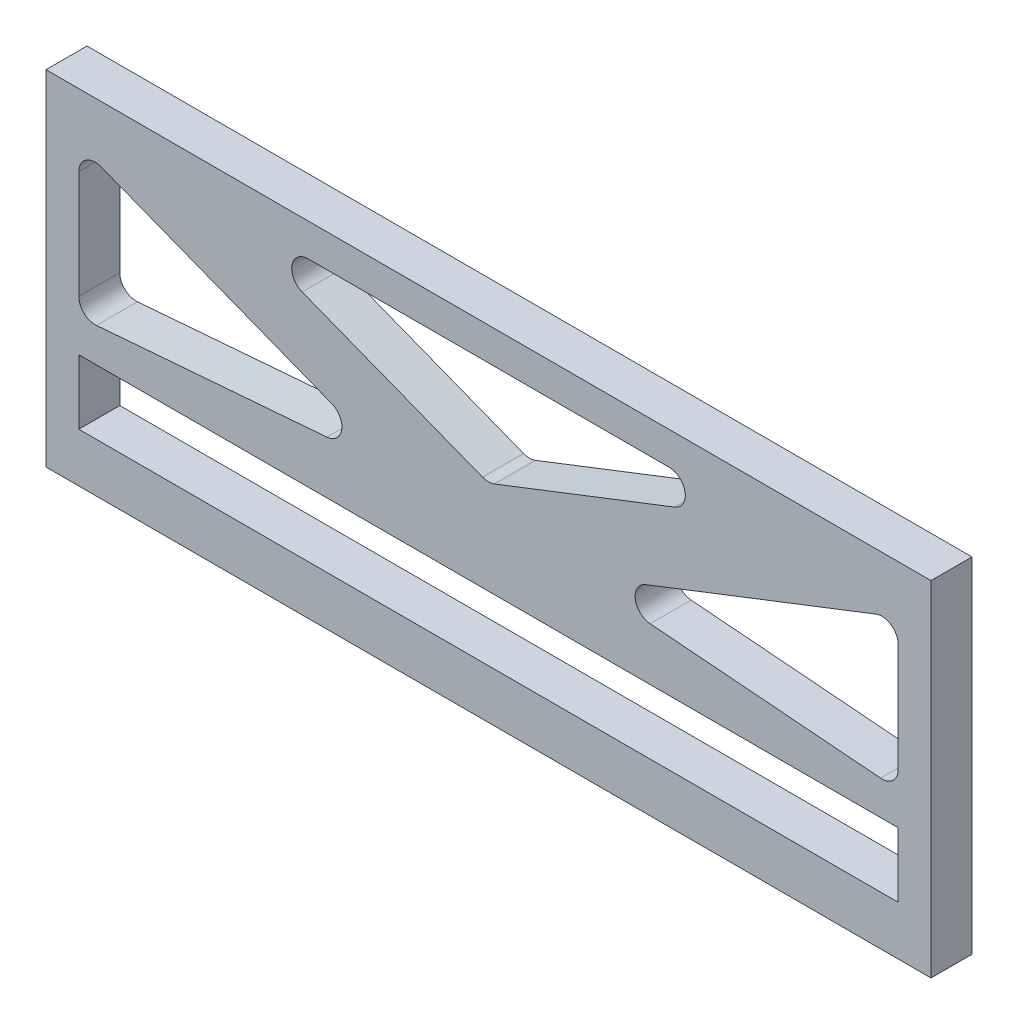
ISO-10303-21;
HEADER;
FILE_DESCRIPTION(('STEP AP214'),'2;1');
FILE_NAME('part.step','',(''),(''),'','','');
FILE_SCHEMA(('AUTOMOTIVE_DESIGN { 1 0 10303 214 1 1 1 1 }'));
ENDSEC;
DATA;
#1=APPLICATION_CONTEXT('core data for automotive mechanical design processes');
#2=APPLICATION_PROTOCOL_DEFINITION('international standard','automotive_design',2000,#1);
#3=PRODUCT_CONTEXT('',#1,'mechanical');
#4=PRODUCT('Part','Part','',(#3));
#5=PRODUCT_RELATED_PRODUCT_CATEGORY('part','',(#4));
#6=PRODUCT_DEFINITION_FORMATION('','',#4);
#7=PRODUCT_DEFINITION_CONTEXT('part definition',#1,'design');
#8=PRODUCT_DEFINITION('design','',#6,#7);
#9=PRODUCT_DEFINITION_SHAPE('','',#8);
#10=(LENGTH_UNIT() NAMED_UNIT(*) SI_UNIT(.MILLI.,.METRE.));
#11=(NAMED_UNIT(*) PLANE_ANGLE_UNIT() SI_UNIT($,.RADIAN.));
#12=(NAMED_UNIT(*) SI_UNIT($,.STERADIAN.) SOLID_ANGLE_UNIT());
#13=UNCERTAINTY_MEASURE_WITH_UNIT(LENGTH_MEASURE(1.E-05),#10,'distance_accuracy_value','');
#14=(GEOMETRIC_REPRESENTATION_CONTEXT(3) GLOBAL_UNCERTAINTY_ASSIGNED_CONTEXT((#13)) GLOBAL_UNIT_ASSIGNED_CONTEXT((#10,
#11,#12)) REPRESENTATION_CONTEXT('',''));
#15=CARTESIAN_POINT('',(0.,0.,0.));
#16=DIRECTION('',(0.,0.,1.));
#17=DIRECTION('',(1.,0.,0.));
#18=AXIS2_PLACEMENT_3D('',#15,#16,#17);
#19=CARTESIAN_POINT('',(0.,0.,3.175));
#20=DIRECTION('',(0.,0.,-1.));
#21=DIRECTION('',(-1.,0.,0.));
#22=AXIS2_PLACEMENT_3D('',#19,#20,#21);
#23=PLANE('',#22);
#24=DIRECTION('',(-0.932004671541296,0.362446261154948,0.));
#25=VECTOR('',#24,1.);
#26=CARTESIAN_POINT('',(-7.0079354437433,0.,3.175));
#27=LINE('',#26,#25);
#28=CARTESIAN_POINT('',(-12.1682666102211,2.00679545363027,3.175));
#29=VERTEX_POINT('',#28);
#30=CARTESIAN_POINT('',(-30.0196932483332,8.94901692400719,3.175));
#31=VERTEX_POINT('',#30);
#32=EDGE_CURVE('E437',#29,#31,#27,.T.);
#33=ORIENTED_EDGE('',*,*,#32,.F.);
#34=CARTESIAN_POINT('',(-12.6285733618879,0.823149520772821,3.175));
#35=DIRECTION('',(0.,0.,-1.));
#36=DIRECTION('',(-1.,0.,0.));
#37=AXIS2_PLACEMENT_3D('',#34,#35,#36);
#38=CIRCLE('',#37,1.27);
#39=CARTESIAN_POINT('',(-12.5270104581819,-0.442782932634869,3.175));
#40=VERTEX_POINT('',#39);
#41=EDGE_CURVE('E412',#29,#40,#38,.T.);
#42=ORIENTED_EDGE('',*,*,#41,.T.);
#43=DIRECTION('',(0.996797207407629,0.07997079031967,0.));
#44=VECTOR('',#43,1.);
#45=CARTESIAN_POINT('',(-31.75,-1.985,3.175));
#46=LINE('',#45,#44);
#47=CARTESIAN_POINT('',(-30.378437096294,-1.87496260365961,3.175));
#48=VERTEX_POINT('',#47);
#49=EDGE_CURVE('E443',#48,#40,#46,.T.);
#50=ORIENTED_EDGE('',*,*,#49,.F.);
#51=CARTESIAN_POINT('',(-30.48,-0.609030150251917,3.175));
#52=DIRECTION('',(0.,0.,-1.));
#53=DIRECTION('',(-1.,0.,0.));
#54=AXIS2_PLACEMENT_3D('',#51,#52,#53);
#55=CIRCLE('',#54,1.27);
#56=CARTESIAN_POINT('',(-31.75,-0.609030150251917,3.175));
#57=VERTEX_POINT('',#56);
#58=EDGE_CURVE('E11',#48,#57,#55,.T.);
#59=ORIENTED_EDGE('',*,*,#58,.T.);
#60=DIRECTION('',(0.,-1.,0.));
#61=VECTOR('',#60,1.);
#62=CARTESIAN_POINT('',(-31.75,9.62191399409983,3.175));
#63=LINE('',#62,#61);
#64=CARTESIAN_POINT('',(-31.75,7.76537099114975,3.175));
#65=VERTEX_POINT('',#64);
#66=EDGE_CURVE('E440',#65,#57,#63,.T.);
#67=ORIENTED_EDGE('',*,*,#66,.F.);
#68=CARTESIAN_POINT('',(-30.48,7.76537099114975,3.175));
#69=DIRECTION('',(0.,0.,-1.));
#70=DIRECTION('',(-1.,0.,0.));
#71=AXIS2_PLACEMENT_3D('',#68,#69,#70);
#72=CIRCLE('',#71,1.27);
#73=EDGE_CURVE('E418',#65,#31,#72,.T.);
#74=ORIENTED_EDGE('',*,*,#73,.T.);
#75=EDGE_LOOP('',(#33,#42,#50,#59,#67,#74));
#76=FACE_BOUND('',#75,.T.);
#77=DIRECTION('',(0.,1.,0.));
#78=VECTOR('',#77,1.);
#79=CARTESIAN_POINT('',(31.75,-9.525,3.175));
#80=LINE('',#79,#78);
#81=CARTESIAN_POINT('',(31.75,-9.525,3.175));
#82=VERTEX_POINT('',#81);
#83=CARTESIAN_POINT('',(31.75,-4.525,3.175));
#84=VERTEX_POINT('',#83);
#85=EDGE_CURVE('E214',#82,#84,#80,.T.);
#86=ORIENTED_EDGE('',*,*,#85,.F.);
#87=DIRECTION('',(1.,0.,0.));
#88=VECTOR('',#87,1.);
#89=CARTESIAN_POINT('',(-31.75,-9.525,3.175));
#90=LINE('',#89,#88);
#91=CARTESIAN_POINT('',(-31.75,-9.525,3.175));
#92=VERTEX_POINT('',#91);
#93=EDGE_CURVE('E244',#92,#82,#90,.T.);
#94=ORIENTED_EDGE('',*,*,#93,.F.);
#95=DIRECTION('',(0.,-1.,0.));
#96=VECTOR('',#95,1.);
#97=CARTESIAN_POINT('',(-31.75,-9.525,3.175));
#98=LINE('',#97,#96);
#99=CARTESIAN_POINT('',(-31.75,-4.525,3.175));
#100=VERTEX_POINT('',#99);
#101=EDGE_CURVE('E240',#100,#92,#98,.T.);
#102=ORIENTED_EDGE('',*,*,#101,.F.);
#103=DIRECTION('',(-1.,0.,0.));
#104=VECTOR('',#103,1.);
#105=CARTESIAN_POINT('',(-31.75,-4.525,3.175));
#106=LINE('',#105,#104);
#107=EDGE_CURVE('E225',#84,#100,#106,.T.);
#108=ORIENTED_EDGE('',*,*,#107,.F.);
#109=EDGE_LOOP('',(#86,#94,#102,#108));
#110=FACE_BOUND('',#109,.T.);
#111=DIRECTION('',(0.,1.,0.));
#112=VECTOR('',#111,1.);
#113=CARTESIAN_POINT('',(34.29,-13.335,3.175));
#114=LINE('',#113,#112);
#115=CARTESIAN_POINT('',(34.29,-13.335,3.175));
#116=VERTEX_POINT('',#115);
#117=CARTESIAN_POINT('',(34.29,13.335,3.175));
#118=VERTEX_POINT('',#117);
#119=EDGE_CURVE('E270',#116,#118,#114,.T.);
#120=ORIENTED_EDGE('',*,*,#119,.T.);
#121=DIRECTION('',(-1.,0.,0.));
#122=VECTOR('',#121,1.);
#123=CARTESIAN_POINT('',(-34.29,13.335,3.175));
#124=LINE('',#123,#122);
#125=CARTESIAN_POINT('',(-34.29,13.335,3.175));
#126=VERTEX_POINT('',#125);
#127=EDGE_CURVE('E274',#118,#126,#124,.T.);
#128=ORIENTED_EDGE('',*,*,#127,.T.);
#129=DIRECTION('',(0.,-1.,0.));
#130=VECTOR('',#129,1.);
#131=CARTESIAN_POINT('',(-34.29,-13.335,3.175));
#132=LINE('',#131,#130);
#133=CARTESIAN_POINT('',(-34.29,-13.335,3.175));
#134=VERTEX_POINT('',#133);
#135=EDGE_CURVE('E278',#126,#134,#132,.T.);
#136=ORIENTED_EDGE('',*,*,#135,.T.);
#137=DIRECTION('',(1.,0.,0.));
#138=VECTOR('',#137,1.);
#139=CARTESIAN_POINT('',(-34.29,-13.335,3.175));
#140=LINE('',#139,#138);
#141=EDGE_CURVE('E281',#134,#116,#140,.T.);
#142=ORIENTED_EDGE('',*,*,#141,.T.);
#143=EDGE_LOOP('',(#120,#128,#136,#142));
#144=FACE_BOUND('',#143,.T.);
#145=DIRECTION('',(-1.,0.,0.));
#146=VECTOR('',#145,1.);
#147=CARTESIAN_POINT('',(20.7506359848282,10.795,3.175));
#148=LINE('',#147,#146);
#149=CARTESIAN_POINT('',(13.9809539772422,10.795,3.175));
#150=VERTEX_POINT('',#149);
#151=CARTESIAN_POINT('',(-13.9809539772422,10.795,3.175));
#152=VERTEX_POINT('',#151);
#153=EDGE_CURVE('E460',#150,#152,#148,.T.);
#154=ORIENTED_EDGE('',*,*,#153,.F.);
#155=CARTESIAN_POINT('',(13.9809539772422,9.52500000000001,3.175));
#156=DIRECTION('',(0.,0.,-1.));
#157=DIRECTION('',(-1.,0.,0.));
#158=AXIS2_PLACEMENT_3D('',#155,#156,#157);
#159=CIRCLE('',#158,1.27);
#160=CARTESIAN_POINT('',(14.441260728909,8.34135406714256,3.175));
#161=VERTEX_POINT('',#160);
#162=EDGE_CURVE('E394',#150,#161,#159,.T.);
#163=ORIENTED_EDGE('',*,*,#162,.T.);
#164=DIRECTION('',(0.932004671541296,0.362446261154949,0.));
#165=VECTOR('',#164,1.);
#166=CARTESIAN_POINT('',(0.,2.72530822812238,3.175));
#167=LINE('',#166,#165);
#168=CARTESIAN_POINT('',(0.460306751666785,2.90431640932613,3.175));
#169=VERTEX_POINT('',#168);
#170=EDGE_CURVE('E253',#169,#161,#167,.T.);
#171=ORIENTED_EDGE('',*,*,#170,.F.);
#172=CARTESIAN_POINT('',(0.,4.08796234218358,3.175));
#173=DIRECTION('',(0.,0.,-1.));
#174=DIRECTION('',(-1.,0.,0.));
#175=AXIS2_PLACEMENT_3D('',#172,#173,#174);
#176=CIRCLE('',#175,1.27);
#177=CARTESIAN_POINT('',(-0.460306751666785,2.90431640932613,3.175));
#178=VERTEX_POINT('',#177);
#179=EDGE_CURVE('E406',#169,#178,#176,.T.);
#180=ORIENTED_EDGE('',*,*,#179,.T.);
#181=DIRECTION('',(0.932004671541296,-0.362446261154949,0.));
#182=VECTOR('',#181,1.);
#183=CARTESIAN_POINT('',(-20.7506359848282,10.795,3.175));
#184=LINE('',#183,#182);
#185=CARTESIAN_POINT('',(-14.441260728909,8.34135406714256,3.175));
#186=VERTEX_POINT('',#185);
#187=EDGE_CURVE('E464',#186,#178,#184,.T.);
#188=ORIENTED_EDGE('',*,*,#187,.F.);
#189=CARTESIAN_POINT('',(-13.9809539772422,9.52500000000001,3.175));
#190=DIRECTION('',(0.,0.,-1.));
#191=DIRECTION('',(-1.,0.,0.));
#192=AXIS2_PLACEMENT_3D('',#189,#190,#191);
#193=CIRCLE('',#192,1.27);
#194=EDGE_CURVE('E400',#186,#152,#193,.T.);
#195=ORIENTED_EDGE('',*,*,#194,.T.);
#196=EDGE_LOOP('',(#154,#163,#171,#180,#188,#195));
#197=FACE_BOUND('',#196,.T.);
#198=DIRECTION('',(0.996797207407629,-0.0799707903196701,0.));
#199=VECTOR('',#198,1.);
#200=CARTESIAN_POINT('',(31.75,-1.985,3.175));
#201=LINE('',#200,#199);
#202=CARTESIAN_POINT('',(12.527010458182,-0.442782932634871,3.175));
#203=VERTEX_POINT('',#202);
#204=CARTESIAN_POINT('',(30.378437096294,-1.87496260365961,3.175));
#205=VERTEX_POINT('',#204);
#206=EDGE_CURVE('E563',#203,#205,#201,.T.);
#207=ORIENTED_EDGE('',*,*,#206,.F.);
#208=CARTESIAN_POINT('',(12.628573361888,0.823149520772818,3.175));
#209=DIRECTION('',(0.,0.,-1.));
#210=DIRECTION('',(-1.,0.,0.));
#211=AXIS2_PLACEMENT_3D('',#208,#209,#210);
#212=CIRCLE('',#211,1.27);
#213=CARTESIAN_POINT('',(12.1682666102212,2.00679545363027,3.175));
#214=VERTEX_POINT('',#213);
#215=EDGE_CURVE('E388',#203,#214,#212,.T.);
#216=ORIENTED_EDGE('',*,*,#215,.T.);
#217=DIRECTION('',(-0.932004671541298,-0.362446261154944,0.));
#218=VECTOR('',#217,1.);
#219=CARTESIAN_POINT('',(7.00793544374329,0.,3.175));
#220=LINE('',#219,#218);
#221=CARTESIAN_POINT('',(30.0196932483333,8.94901692400708,3.175));
#222=VERTEX_POINT('',#221);
#223=EDGE_CURVE('E457',#222,#214,#220,.T.);
#224=ORIENTED_EDGE('',*,*,#223,.F.);
#225=CARTESIAN_POINT('',(30.48,7.76537099114963,3.175));
#226=DIRECTION('',(0.,0.,-1.));
#227=DIRECTION('',(-1.,0.,0.));
#228=AXIS2_PLACEMENT_3D('',#225,#226,#227);
#229=CIRCLE('',#228,1.27);
#230=CARTESIAN_POINT('',(31.75,7.76537099114963,3.175));
#231=VERTEX_POINT('',#230);
#232=EDGE_CURVE('E376',#222,#231,#229,.T.);
#233=ORIENTED_EDGE('',*,*,#232,.T.);
#234=DIRECTION('',(0.,1.,0.));
#235=VECTOR('',#234,1.);
#236=CARTESIAN_POINT('',(31.75,9.62191399409971,3.175));
#237=LINE('',#236,#235);
#238=CARTESIAN_POINT('',(31.75,-0.609030150251917,3.175));
#239=VERTEX_POINT('',#238);
#240=EDGE_CURVE('E566',#239,#231,#237,.T.);
#241=ORIENTED_EDGE('',*,*,#240,.F.);
#242=CARTESIAN_POINT('',(30.48,-0.609030150251917,3.175));
#243=DIRECTION('',(0.,0.,-1.));
#244=DIRECTION('',(-1.,0.,0.));
#245=AXIS2_PLACEMENT_3D('',#242,#243,#244);
#246=CIRCLE('',#245,1.27);
#247=EDGE_CURVE('E382',#239,#205,#246,.T.);
#248=ORIENTED_EDGE('',*,*,#247,.T.);
#249=EDGE_LOOP('',(#207,#216,#224,#233,#241,#248));
#250=FACE_BOUND('',#249,.T.);
#251=ADVANCED_FACE('F39',(#76,#110,#144,#197,#250),#23,.F.);
#252=CARTESIAN_POINT('',(0.,0.,0.));
#253=DIRECTION('',(0.,0.,-1.));
#254=DIRECTION('',(-1.,0.,0.));
#255=AXIS2_PLACEMENT_3D('',#252,#253,#254);
#256=PLANE('',#255);
#257=DIRECTION('',(0.,1.,0.));
#258=VECTOR('',#257,1.);
#259=CARTESIAN_POINT('',(34.29,-13.335,0.));
#260=LINE('',#259,#258);
#261=CARTESIAN_POINT('',(34.29,-13.335,0.));
#262=VERTEX_POINT('',#261);
#263=CARTESIAN_POINT('',(34.29,13.335,0.));
#264=VERTEX_POINT('',#263);
#265=EDGE_CURVE('E234',#262,#264,#260,.T.);
#266=ORIENTED_EDGE('',*,*,#265,.F.);
#267=DIRECTION('',(1.,0.,0.));
#268=VECTOR('',#267,1.);
#269=CARTESIAN_POINT('',(-34.29,-13.335,0.));
#270=LINE('',#269,#268);
#271=CARTESIAN_POINT('',(-34.29,-13.335,0.));
#272=VERTEX_POINT('',#271);
#273=EDGE_CURVE('E275',#272,#262,#270,.T.);
#274=ORIENTED_EDGE('',*,*,#273,.F.);
#275=DIRECTION('',(0.,-1.,0.));
#276=VECTOR('',#275,1.);
#277=CARTESIAN_POINT('',(-34.29,-13.335,0.));
#278=LINE('',#277,#276);
#279=CARTESIAN_POINT('',(-34.29,13.335,0.));
#280=VERTEX_POINT('',#279);
#281=EDGE_CURVE('E291',#280,#272,#278,.T.);
#282=ORIENTED_EDGE('',*,*,#281,.F.);
#283=DIRECTION('',(-1.,0.,0.));
#284=VECTOR('',#283,1.);
#285=CARTESIAN_POINT('',(-34.29,13.335,0.));
#286=LINE('',#285,#284);
#287=EDGE_CURVE('E288',#264,#280,#286,.T.);
#288=ORIENTED_EDGE('',*,*,#287,.F.);
#289=EDGE_LOOP('',(#266,#274,#282,#288));
#290=FACE_BOUND('',#289,.T.);
#291=DIRECTION('',(1.,0.,0.));
#292=VECTOR('',#291,1.);
#293=CARTESIAN_POINT('',(-31.75,-9.525,0.));
#294=LINE('',#293,#292);
#295=CARTESIAN_POINT('',(-31.75,-9.525,0.));
#296=VERTEX_POINT('',#295);
#297=CARTESIAN_POINT('',(31.75,-9.525,0.));
#298=VERTEX_POINT('',#297);
#299=EDGE_CURVE('E226',#296,#298,#294,.T.);
#300=ORIENTED_EDGE('',*,*,#299,.T.);
#301=DIRECTION('',(0.,1.,0.));
#302=VECTOR('',#301,1.);
#303=CARTESIAN_POINT('',(31.75,-9.525,0.));
#304=LINE('',#303,#302);
#305=CARTESIAN_POINT('',(31.75,-4.525,0.));
#306=VERTEX_POINT('',#305);
#307=EDGE_CURVE('E250',#298,#306,#304,.T.);
#308=ORIENTED_EDGE('',*,*,#307,.T.);
#309=DIRECTION('',(-1.,0.,0.));
#310=VECTOR('',#309,1.);
#311=CARTESIAN_POINT('',(-31.75,-4.525,0.));
#312=LINE('',#311,#310);
#313=CARTESIAN_POINT('',(-31.75,-4.525,0.));
#314=VERTEX_POINT('',#313);
#315=EDGE_CURVE('E232',#306,#314,#312,.T.);
#316=ORIENTED_EDGE('',*,*,#315,.T.);
#317=DIRECTION('',(0.,-1.,0.));
#318=VECTOR('',#317,1.);
#319=CARTESIAN_POINT('',(-31.75,-9.525,0.));
#320=LINE('',#319,#318);
#321=EDGE_CURVE('E256',#314,#296,#320,.T.);
#322=ORIENTED_EDGE('',*,*,#321,.T.);
#323=EDGE_LOOP('',(#300,#308,#316,#322));
#324=FACE_BOUND('',#323,.T.);
#325=DIRECTION('',(0.932004671541296,-0.362446261154949,0.));
#326=VECTOR('',#325,1.);
#327=CARTESIAN_POINT('',(-20.7506359848282,10.795,0.));
#328=LINE('',#327,#326);
#329=CARTESIAN_POINT('',(-14.441260728909,8.34135406714256,0.));
#330=VERTEX_POINT('',#329);
#331=CARTESIAN_POINT('',(-0.460306751666785,2.90431640932613,0.));
#332=VERTEX_POINT('',#331);
#333=EDGE_CURVE('E475',#330,#332,#328,.T.);
#334=ORIENTED_EDGE('',*,*,#333,.T.);
#335=CARTESIAN_POINT('',(0.,4.08796234218358,0.));
#336=DIRECTION('',(0.,0.,-1.));
#337=DIRECTION('',(-1.,0.,0.));
#338=AXIS2_PLACEMENT_3D('',#335,#336,#337);
#339=CIRCLE('',#338,1.27);
#340=CARTESIAN_POINT('',(0.460306751666785,2.90431640932613,0.));
#341=VERTEX_POINT('',#340);
#342=EDGE_CURVE('E403',#332,#341,#339,.F.);
#343=ORIENTED_EDGE('',*,*,#342,.T.);
#344=DIRECTION('',(0.932004671541296,0.362446261154949,0.));
#345=VECTOR('',#344,1.);
#346=CARTESIAN_POINT('',(0.,2.72530822812238,0.));
#347=LINE('',#346,#345);
#348=CARTESIAN_POINT('',(14.441260728909,8.34135406714256,0.));
#349=VERTEX_POINT('',#348);
#350=EDGE_CURVE('E465',#341,#349,#347,.T.);
#351=ORIENTED_EDGE('',*,*,#350,.T.);
#352=CARTESIAN_POINT('',(13.9809539772422,9.52500000000001,0.));
#353=DIRECTION('',(0.,0.,-1.));
#354=DIRECTION('',(-1.,0.,0.));
#355=AXIS2_PLACEMENT_3D('',#352,#353,#354);
#356=CIRCLE('',#355,1.27);
#357=CARTESIAN_POINT('',(13.9809539772422,10.795,0.));
#358=VERTEX_POINT('',#357);
#359=EDGE_CURVE('E391',#349,#358,#356,.F.);
#360=ORIENTED_EDGE('',*,*,#359,.T.);
#361=DIRECTION('',(-1.,0.,0.));
#362=VECTOR('',#361,1.);
#363=CARTESIAN_POINT('',(20.7506359848282,10.795,0.));
#364=LINE('',#363,#362);
#365=CARTESIAN_POINT('',(-13.9809539772422,10.795,0.));
#366=VERTEX_POINT('',#365);
#367=EDGE_CURVE('E447',#358,#366,#364,.T.);
#368=ORIENTED_EDGE('',*,*,#367,.T.);
#369=CARTESIAN_POINT('',(-13.9809539772422,9.52500000000001,0.));
#370=DIRECTION('',(0.,0.,-1.));
#371=DIRECTION('',(-1.,0.,0.));
#372=AXIS2_PLACEMENT_3D('',#369,#370,#371);
#373=CIRCLE('',#372,1.27);
#374=EDGE_CURVE('E397',#366,#330,#373,.F.);
#375=ORIENTED_EDGE('',*,*,#374,.T.);
#376=EDGE_LOOP('',(#334,#343,#351,#360,#368,#375));
#377=FACE_BOUND('',#376,.T.);
#378=DIRECTION('',(0.,-1.,0.));
#379=VECTOR('',#378,1.);
#380=CARTESIAN_POINT('',(-31.75,9.62191399409983,0.));
#381=LINE('',#380,#379);
#382=CARTESIAN_POINT('',(-31.75,7.76537099114975,0.));
#383=VERTEX_POINT('',#382);
#384=CARTESIAN_POINT('',(-31.75,-0.609030150251917,0.));
#385=VERTEX_POINT('',#384);
#386=EDGE_CURVE('E428',#383,#385,#381,.T.);
#387=ORIENTED_EDGE('',*,*,#386,.T.);
#388=CARTESIAN_POINT('',(-30.48,-0.609030150251917,0.));
#389=DIRECTION('',(0.,0.,-1.));
#390=DIRECTION('',(-1.,0.,0.));
#391=AXIS2_PLACEMENT_3D('',#388,#389,#390);
#392=CIRCLE('',#391,1.27);
#393=CARTESIAN_POINT('',(-30.378437096294,-1.87496260365961,0.));
#394=VERTEX_POINT('',#393);
#395=EDGE_CURVE('E48',#385,#394,#392,.F.);
#396=ORIENTED_EDGE('',*,*,#395,.T.);
#397=DIRECTION('',(0.996797207407629,0.07997079031967,0.));
#398=VECTOR('',#397,1.);
#399=CARTESIAN_POINT('',(-31.75,-1.985,0.));
#400=LINE('',#399,#398);
#401=CARTESIAN_POINT('',(-12.5270104581819,-0.442782932634869,0.));
#402=VERTEX_POINT('',#401);
#403=EDGE_CURVE('E427',#394,#402,#400,.T.);
#404=ORIENTED_EDGE('',*,*,#403,.T.);
#405=CARTESIAN_POINT('',(-12.6285733618879,0.823149520772821,0.));
#406=DIRECTION('',(0.,0.,-1.));
#407=DIRECTION('',(-1.,0.,0.));
#408=AXIS2_PLACEMENT_3D('',#405,#406,#407);
#409=CIRCLE('',#408,1.27);
#410=CARTESIAN_POINT('',(-12.1682666102211,2.00679545363027,0.));
#411=VERTEX_POINT('',#410);
#412=EDGE_CURVE('E409',#402,#411,#409,.F.);
#413=ORIENTED_EDGE('',*,*,#412,.T.);
#414=DIRECTION('',(-0.932004671541296,0.362446261154948,0.));
#415=VECTOR('',#414,1.);
#416=CARTESIAN_POINT('',(-7.0079354437433,0.,0.));
#417=LINE('',#416,#415);
#418=CARTESIAN_POINT('',(-30.0196932483332,8.94901692400719,0.));
#419=VERTEX_POINT('',#418);
#420=EDGE_CURVE('E453',#411,#419,#417,.T.);
#421=ORIENTED_EDGE('',*,*,#420,.T.);
#422=CARTESIAN_POINT('',(-30.48,7.76537099114975,0.));
#423=DIRECTION('',(0.,0.,-1.));
#424=DIRECTION('',(-1.,0.,0.));
#425=AXIS2_PLACEMENT_3D('',#422,#423,#424);
#426=CIRCLE('',#425,1.27);
#427=EDGE_CURVE('E415',#419,#383,#426,.F.);
#428=ORIENTED_EDGE('',*,*,#427,.T.);
#429=EDGE_LOOP('',(#387,#396,#404,#413,#421,#428));
#430=FACE_BOUND('',#429,.T.);
#431=DIRECTION('',(0.,1.,0.));
#432=VECTOR('',#431,1.);
#433=CARTESIAN_POINT('',(31.75,9.62191399409971,0.));
#434=LINE('',#433,#432);
#435=CARTESIAN_POINT('',(31.75,-0.609030150251917,0.));
#436=VERTEX_POINT('',#435);
#437=CARTESIAN_POINT('',(31.75,7.76537099114963,0.));
#438=VERTEX_POINT('',#437);
#439=EDGE_CURVE('E579',#436,#438,#434,.T.);
#440=ORIENTED_EDGE('',*,*,#439,.T.);
#441=CARTESIAN_POINT('',(30.48,7.76537099114963,0.));
#442=DIRECTION('',(0.,0.,-1.));
#443=DIRECTION('',(-1.,0.,0.));
#444=AXIS2_PLACEMENT_3D('',#441,#442,#443);
#445=CIRCLE('',#444,1.27);
#446=CARTESIAN_POINT('',(30.0196932483333,8.94901692400708,0.));
#447=VERTEX_POINT('',#446);
#448=EDGE_CURVE('E373',#438,#447,#445,.F.);
#449=ORIENTED_EDGE('',*,*,#448,.T.);
#450=DIRECTION('',(-0.932004671541298,-0.362446261154944,0.));
#451=VECTOR('',#450,1.);
#452=CARTESIAN_POINT('',(7.00793544374329,0.,0.));
#453=LINE('',#452,#451);
#454=CARTESIAN_POINT('',(12.1682666102212,2.00679545363027,0.));
#455=VERTEX_POINT('',#454);
#456=EDGE_CURVE('E573',#447,#455,#453,.T.);
#457=ORIENTED_EDGE('',*,*,#456,.T.);
#458=CARTESIAN_POINT('',(12.628573361888,0.823149520772818,0.));
#459=DIRECTION('',(0.,0.,-1.));
#460=DIRECTION('',(-1.,0.,0.));
#461=AXIS2_PLACEMENT_3D('',#458,#459,#460);
#462=CIRCLE('',#461,1.27);
#463=CARTESIAN_POINT('',(12.527010458182,-0.442782932634871,0.));
#464=VERTEX_POINT('',#463);
#465=EDGE_CURVE('E385',#455,#464,#462,.F.);
#466=ORIENTED_EDGE('',*,*,#465,.T.);
#467=DIRECTION('',(0.996797207407629,-0.0799707903196701,0.));
#468=VECTOR('',#467,1.);
#469=CARTESIAN_POINT('',(31.75,-1.985,0.));
#470=LINE('',#469,#468);
#471=CARTESIAN_POINT('',(30.378437096294,-1.87496260365961,0.));
#472=VERTEX_POINT('',#471);
#473=EDGE_CURVE('E584',#464,#472,#470,.T.);
#474=ORIENTED_EDGE('',*,*,#473,.T.);
#475=CARTESIAN_POINT('',(30.48,-0.609030150251917,0.));
#476=DIRECTION('',(0.,0.,-1.));
#477=DIRECTION('',(-1.,0.,0.));
#478=AXIS2_PLACEMENT_3D('',#475,#476,#477);
#479=CIRCLE('',#478,1.27);
#480=EDGE_CURVE('E379',#472,#436,#479,.F.);
#481=ORIENTED_EDGE('',*,*,#480,.T.);
#482=EDGE_LOOP('',(#440,#449,#457,#466,#474,#481));
#483=FACE_BOUND('',#482,.T.);
#484=ADVANCED_FACE('F425',(#290,#324,#377,#430,#483),#256,.T.);
#485=CARTESIAN_POINT('',(34.29,-13.335,3.175));
#486=DIRECTION('',(-1.,0.,0.));
#487=DIRECTION('',(0.,0.,1.));
#488=AXIS2_PLACEMENT_3D('',#485,#486,#487);
#489=PLANE('',#488);
#490=ORIENTED_EDGE('',*,*,#265,.T.);
#491=DIRECTION('',(0.,0.,-1.));
#492=VECTOR('',#491,1.);
#493=CARTESIAN_POINT('',(34.29,13.335,3.175));
#494=LINE('',#493,#492);
#495=EDGE_CURVE('E307',#118,#264,#494,.T.);
#496=ORIENTED_EDGE('',*,*,#495,.F.);
#497=ORIENTED_EDGE('',*,*,#119,.F.);
#498=DIRECTION('',(0.,0.,-1.));
#499=VECTOR('',#498,1.);
#500=CARTESIAN_POINT('',(34.29,-13.335,3.175));
#501=LINE('',#500,#499);
#502=EDGE_CURVE('E284',#116,#262,#501,.T.);
#503=ORIENTED_EDGE('',*,*,#502,.T.);
#504=EDGE_LOOP('',(#490,#496,#497,#503));
#505=FACE_BOUND('',#504,.T.);
#506=ADVANCED_FACE('F526',(#505),#489,.F.);
#507=CARTESIAN_POINT('',(-34.29,13.335,3.175));
#508=DIRECTION('',(0.,-1.,0.));
#509=DIRECTION('',(0.,0.,-1.));
#510=AXIS2_PLACEMENT_3D('',#507,#508,#509);
#511=PLANE('',#510);
#512=ORIENTED_EDGE('',*,*,#287,.T.);
#513=DIRECTION('',(0.,0.,-1.));
#514=VECTOR('',#513,1.);
#515=CARTESIAN_POINT('',(-34.29,13.335,3.175));
#516=LINE('',#515,#514);
#517=EDGE_CURVE('E303',#126,#280,#516,.T.);
#518=ORIENTED_EDGE('',*,*,#517,.F.);
#519=ORIENTED_EDGE('',*,*,#127,.F.);
#520=ORIENTED_EDGE('',*,*,#495,.T.);
#521=EDGE_LOOP('',(#512,#518,#519,#520));
#522=FACE_BOUND('',#521,.T.);
#523=ADVANCED_FACE('F540',(#522),#511,.F.);
#524=CARTESIAN_POINT('',(-34.29,-13.335,3.175));
#525=DIRECTION('',(1.,0.,0.));
#526=DIRECTION('',(0.,0.,-1.));
#527=AXIS2_PLACEMENT_3D('',#524,#525,#526);
#528=PLANE('',#527);
#529=ORIENTED_EDGE('',*,*,#281,.T.);
#530=DIRECTION('',(0.,0.,-1.));
#531=VECTOR('',#530,1.);
#532=CARTESIAN_POINT('',(-34.29,-13.335,3.175));
#533=LINE('',#532,#531);
#534=EDGE_CURVE('E299',#134,#272,#533,.T.);
#535=ORIENTED_EDGE('',*,*,#534,.F.);
#536=ORIENTED_EDGE('',*,*,#135,.F.);
#537=ORIENTED_EDGE('',*,*,#517,.T.);
#538=EDGE_LOOP('',(#529,#535,#536,#537));
#539=FACE_BOUND('',#538,.T.);
#540=ADVANCED_FACE('F536',(#539),#528,.F.);
#541=CARTESIAN_POINT('',(-34.29,-13.335,3.175));
#542=DIRECTION('',(0.,1.,0.));
#543=DIRECTION('',(-1.,0.,0.));
#544=AXIS2_PLACEMENT_3D('',#541,#542,#543);
#545=PLANE('',#544);
#546=ORIENTED_EDGE('',*,*,#273,.T.);
#547=ORIENTED_EDGE('',*,*,#502,.F.);
#548=ORIENTED_EDGE('',*,*,#141,.F.);
#549=ORIENTED_EDGE('',*,*,#534,.T.);
#550=EDGE_LOOP('',(#546,#547,#548,#549));
#551=FACE_BOUND('',#550,.T.);
#552=ADVANCED_FACE('F533',(#551),#545,.F.);
#553=CARTESIAN_POINT('',(31.75,-9.525,3.175));
#554=DIRECTION('',(-1.,0.,0.));
#555=DIRECTION('',(0.,-1.,0.));
#556=AXIS2_PLACEMENT_3D('',#553,#554,#555);
#557=PLANE('',#556);
#558=ORIENTED_EDGE('',*,*,#307,.F.);
#559=DIRECTION('',(0.,0.,-1.));
#560=VECTOR('',#559,1.);
#561=CARTESIAN_POINT('',(31.75,-9.525,3.175));
#562=LINE('',#561,#560);
#563=EDGE_CURVE('E220',#82,#298,#562,.T.);
#564=ORIENTED_EDGE('',*,*,#563,.F.);
#565=ORIENTED_EDGE('',*,*,#85,.T.);
#566=DIRECTION('',(0.,0.,-1.));
#567=VECTOR('',#566,1.);
#568=CARTESIAN_POINT('',(31.75,-4.525,3.175));
#569=LINE('',#568,#567);
#570=EDGE_CURVE('E217',#84,#306,#569,.T.);
#571=ORIENTED_EDGE('',*,*,#570,.T.);
#572=EDGE_LOOP('',(#558,#564,#565,#571));
#573=FACE_BOUND('',#572,.T.);
#574=ADVANCED_FACE('F216',(#573),#557,.T.);
#575=CARTESIAN_POINT('',(-31.75,-4.525,3.175));
#576=DIRECTION('',(0.,-1.,0.));
#577=DIRECTION('',(0.,0.,-1.));
#578=AXIS2_PLACEMENT_3D('',#575,#576,#577);
#579=PLANE('',#578);
#580=ORIENTED_EDGE('',*,*,#315,.F.);
#581=ORIENTED_EDGE('',*,*,#570,.F.);
#582=ORIENTED_EDGE('',*,*,#107,.T.);
#583=DIRECTION('',(0.,0.,-1.));
#584=VECTOR('',#583,1.);
#585=CARTESIAN_POINT('',(-31.75,-4.525,3.175));
#586=LINE('',#585,#584);
#587=EDGE_CURVE('E235',#100,#314,#586,.T.);
#588=ORIENTED_EDGE('',*,*,#587,.T.);
#589=EDGE_LOOP('',(#580,#581,#582,#588));
#590=FACE_BOUND('',#589,.T.);
#591=ADVANCED_FACE('F229',(#590),#579,.T.);
#592=CARTESIAN_POINT('',(-31.75,-9.525,3.175));
#593=DIRECTION('',(1.,0.,0.));
#594=DIRECTION('',(0.,1.,0.));
#595=AXIS2_PLACEMENT_3D('',#592,#593,#594);
#596=PLANE('',#595);
#597=ORIENTED_EDGE('',*,*,#321,.F.);
#598=ORIENTED_EDGE('',*,*,#587,.F.);
#599=ORIENTED_EDGE('',*,*,#101,.T.);
#600=DIRECTION('',(0.,0.,-1.));
#601=VECTOR('',#600,1.);
#602=CARTESIAN_POINT('',(-31.75,-9.525,3.175));
#603=LINE('',#602,#601);
#604=EDGE_CURVE('E265',#92,#296,#603,.T.);
#605=ORIENTED_EDGE('',*,*,#604,.T.);
#606=EDGE_LOOP('',(#597,#598,#599,#605));
#607=FACE_BOUND('',#606,.T.);
#608=ADVANCED_FACE('F625',(#607),#596,.T.);
#609=CARTESIAN_POINT('',(-31.75,-9.525,3.175));
#610=DIRECTION('',(0.,1.,0.));
#611=DIRECTION('',(0.,0.,1.));
#612=AXIS2_PLACEMENT_3D('',#609,#610,#611);
#613=PLANE('',#612);
#614=ORIENTED_EDGE('',*,*,#299,.F.);
#615=ORIENTED_EDGE('',*,*,#604,.F.);
#616=ORIENTED_EDGE('',*,*,#93,.T.);
#617=ORIENTED_EDGE('',*,*,#563,.T.);
#618=EDGE_LOOP('',(#614,#615,#616,#617));
#619=FACE_BOUND('',#618,.T.);
#620=ADVANCED_FACE('F622',(#619),#613,.T.);
#621=CARTESIAN_POINT('',(20.7506359848282,10.795,3.175));
#622=DIRECTION('',(0.,-1.,0.));
#623=DIRECTION('',(0.,0.,-1.));
#624=AXIS2_PLACEMENT_3D('',#621,#622,#623);
#625=PLANE('',#624);
#626=ORIENTED_EDGE('',*,*,#367,.F.);
#627=DIRECTION('',(0.,0.,-1.));
#628=VECTOR('',#627,1.);
#629=CARTESIAN_POINT('',(13.9809539772422,10.795,3.175));
#630=LINE('',#629,#628);
#631=EDGE_CURVE('E343',#358,#150,#630,.F.);
#632=ORIENTED_EDGE('',*,*,#631,.T.);
#633=ORIENTED_EDGE('',*,*,#153,.T.);
#634=DIRECTION('',(0.,0.,-1.));
#635=VECTOR('',#634,1.);
#636=CARTESIAN_POINT('',(-13.9809539772422,10.795,0.));
#637=LINE('',#636,#635);
#638=EDGE_CURVE('E339',#152,#366,#637,.T.);
#639=ORIENTED_EDGE('',*,*,#638,.T.);
#640=EDGE_LOOP('',(#626,#632,#633,#639));
#641=FACE_BOUND('',#640,.T.);
#642=ADVANCED_FACE('F506',(#641),#625,.T.);
#643=CARTESIAN_POINT('',(-20.7506359848282,10.795,3.175));
#644=DIRECTION('',(0.362446261154949,0.932004671541296,0.));
#645=DIRECTION('',(-0.932004671541296,0.362446261154949,0.));
#646=AXIS2_PLACEMENT_3D('',#643,#644,#645);
#647=PLANE('',#646);
#648=ORIENTED_EDGE('',*,*,#333,.F.);
#649=DIRECTION('',(0.,0.,-1.));
#650=VECTOR('',#649,1.);
#651=CARTESIAN_POINT('',(-14.441260728909,8.34135406714256,3.175));
#652=LINE('',#651,#650);
#653=EDGE_CURVE('E350',#330,#186,#652,.F.);
#654=ORIENTED_EDGE('',*,*,#653,.T.);
#655=ORIENTED_EDGE('',*,*,#187,.T.);
#656=DIRECTION('',(0.,0.,-1.));
#657=VECTOR('',#656,1.);
#658=CARTESIAN_POINT('',(-0.460306751666785,2.90431640932613,0.));
#659=LINE('',#658,#657);
#660=EDGE_CURVE('E346',#178,#332,#659,.T.);
#661=ORIENTED_EDGE('',*,*,#660,.T.);
#662=EDGE_LOOP('',(#648,#654,#655,#661));
#663=FACE_BOUND('',#662,.T.);
#664=ADVANCED_FACE('F499',(#663),#647,.T.);
#665=CARTESIAN_POINT('',(0.,2.72530822812238,3.175));
#666=DIRECTION('',(-0.362446261154949,0.932004671541296,0.));
#667=DIRECTION('',(-0.932004671541296,-0.362446261154949,0.));
#668=AXIS2_PLACEMENT_3D('',#665,#666,#667);
#669=PLANE('',#668);
#670=ORIENTED_EDGE('',*,*,#170,.T.);
#671=DIRECTION('',(0.,0.,-1.));
#672=VECTOR('',#671,1.);
#673=CARTESIAN_POINT('',(14.441260728909,8.34135406714256,0.));
#674=LINE('',#673,#672);
#675=EDGE_CURVE('E335',#161,#349,#674,.T.);
#676=ORIENTED_EDGE('',*,*,#675,.T.);
#677=ORIENTED_EDGE('',*,*,#350,.F.);
#678=DIRECTION('',(0.,0.,-1.));
#679=VECTOR('',#678,1.);
#680=CARTESIAN_POINT('',(0.460306751666785,2.90431640932613,3.175));
#681=LINE('',#680,#679);
#682=EDGE_CURVE('E332',#341,#169,#681,.F.);
#683=ORIENTED_EDGE('',*,*,#682,.T.);
#684=EDGE_LOOP('',(#670,#676,#677,#683));
#685=FACE_BOUND('',#684,.T.);
#686=ADVANCED_FACE('F485',(#685),#669,.T.);
#687=CARTESIAN_POINT('',(-7.0079354437433,0.,3.175));
#688=DIRECTION('',(-0.362446261154948,-0.932004671541296,0.));
#689=DIRECTION('',(0.932004671541296,-0.362446261154948,0.));
#690=AXIS2_PLACEMENT_3D('',#687,#688,#689);
#691=PLANE('',#690);
#692=ORIENTED_EDGE('',*,*,#420,.F.);
#693=DIRECTION('',(0.,0.,-1.));
#694=VECTOR('',#693,1.);
#695=CARTESIAN_POINT('',(-12.1682666102211,2.00679545363027,3.175));
#696=LINE('',#695,#694);
#697=EDGE_CURVE('E364',#411,#29,#696,.F.);
#698=ORIENTED_EDGE('',*,*,#697,.T.);
#699=ORIENTED_EDGE('',*,*,#32,.T.);
#700=DIRECTION('',(0.,0.,-1.));
#701=VECTOR('',#700,1.);
#702=CARTESIAN_POINT('',(-30.0196932483332,8.94901692400719,0.));
#703=LINE('',#702,#701);
#704=EDGE_CURVE('E360',#31,#419,#703,.T.);
#705=ORIENTED_EDGE('',*,*,#704,.T.);
#706=EDGE_LOOP('',(#692,#698,#699,#705));
#707=FACE_BOUND('',#706,.T.);
#708=ADVANCED_FACE('F612',(#707),#691,.T.);
#709=CARTESIAN_POINT('',(-31.75,9.62191399409983,3.175));
#710=DIRECTION('',(1.,0.,0.));
#711=DIRECTION('',(0.,0.,-1.));
#712=AXIS2_PLACEMENT_3D('',#709,#710,#711);
#713=PLANE('',#712);
#714=ORIENTED_EDGE('',*,*,#386,.F.);
#715=DIRECTION('',(0.,0.,-1.));
#716=VECTOR('',#715,1.);
#717=CARTESIAN_POINT('',(-31.75,7.76537099114975,3.175));
#718=LINE('',#717,#716);
#719=EDGE_CURVE('E60',#383,#65,#718,.F.);
#720=ORIENTED_EDGE('',*,*,#719,.T.);
#721=ORIENTED_EDGE('',*,*,#66,.T.);
#722=DIRECTION('',(0.,0.,-1.));
#723=VECTOR('',#722,1.);
#724=CARTESIAN_POINT('',(-31.75,-0.609030150251917,0.));
#725=LINE('',#724,#723);
#726=EDGE_CURVE('E367',#57,#385,#725,.T.);
#727=ORIENTED_EDGE('',*,*,#726,.T.);
#728=EDGE_LOOP('',(#714,#720,#721,#727));
#729=FACE_BOUND('',#728,.T.);
#730=ADVANCED_FACE('F439',(#729),#713,.T.);
#731=CARTESIAN_POINT('',(-31.75,-1.985,3.175));
#732=DIRECTION('',(-0.07997079031967,0.996797207407629,0.));
#733=DIRECTION('',(-0.996797207407629,-0.07997079031967,0.));
#734=AXIS2_PLACEMENT_3D('',#731,#732,#733);
#735=PLANE('',#734);
#736=ORIENTED_EDGE('',*,*,#49,.T.);
#737=DIRECTION('',(0.,0.,-1.));
#738=VECTOR('',#737,1.);
#739=CARTESIAN_POINT('',(-12.5270104581819,-0.442782932634869,0.));
#740=LINE('',#739,#738);
#741=EDGE_CURVE('E356',#40,#402,#740,.T.);
#742=ORIENTED_EDGE('',*,*,#741,.T.);
#743=ORIENTED_EDGE('',*,*,#403,.F.);
#744=DIRECTION('',(0.,0.,-1.));
#745=VECTOR('',#744,1.);
#746=CARTESIAN_POINT('',(-30.378437096294,-1.87496260365961,3.175));
#747=LINE('',#746,#745);
#748=EDGE_CURVE('E353',#394,#48,#747,.F.);
#749=ORIENTED_EDGE('',*,*,#748,.T.);
#750=EDGE_LOOP('',(#736,#742,#743,#749));
#751=FACE_BOUND('',#750,.T.);
#752=ADVANCED_FACE('F434',(#751),#735,.T.);
#753=CARTESIAN_POINT('',(31.75,-1.985,3.175));
#754=DIRECTION('',(0.0799707903196701,0.996797207407629,0.));
#755=DIRECTION('',(-0.996797207407629,0.0799707903196701,0.));
#756=AXIS2_PLACEMENT_3D('',#753,#754,#755);
#757=PLANE('',#756);
#758=ORIENTED_EDGE('',*,*,#206,.T.);
#759=DIRECTION('',(0.,0.,-1.));
#760=VECTOR('',#759,1.);
#761=CARTESIAN_POINT('',(30.378437096294,-1.8749626036596,0.));
#762=LINE('',#761,#760);
#763=EDGE_CURVE('E328',#205,#472,#762,.T.);
#764=ORIENTED_EDGE('',*,*,#763,.T.);
#765=ORIENTED_EDGE('',*,*,#473,.F.);
#766=DIRECTION('',(0.,0.,-1.));
#767=VECTOR('',#766,1.);
#768=CARTESIAN_POINT('',(12.527010458182,-0.442782932634871,3.175));
#769=LINE('',#768,#767);
#770=EDGE_CURVE('E325',#464,#203,#769,.F.);
#771=ORIENTED_EDGE('',*,*,#770,.T.);
#772=EDGE_LOOP('',(#758,#764,#765,#771));
#773=FACE_BOUND('',#772,.T.);
#774=ADVANCED_FACE('F568',(#773),#757,.T.);
#775=CARTESIAN_POINT('',(31.75,9.62191399409971,3.175));
#776=DIRECTION('',(-1.,0.,0.));
#777=DIRECTION('',(0.,-1.,0.));
#778=AXIS2_PLACEMENT_3D('',#775,#776,#777);
#779=PLANE('',#778);
#780=ORIENTED_EDGE('',*,*,#240,.T.);
#781=DIRECTION('',(0.,0.,-1.));
#782=VECTOR('',#781,1.);
#783=CARTESIAN_POINT('',(31.75,7.76537099114963,0.));
#784=LINE('',#783,#782);
#785=EDGE_CURVE('E314',#231,#438,#784,.T.);
#786=ORIENTED_EDGE('',*,*,#785,.T.);
#787=ORIENTED_EDGE('',*,*,#439,.F.);
#788=DIRECTION('',(0.,0.,-1.));
#789=VECTOR('',#788,1.);
#790=CARTESIAN_POINT('',(31.75,-0.60903015025192,3.175));
#791=LINE('',#790,#789);
#792=EDGE_CURVE('E311',#436,#239,#791,.F.);
#793=ORIENTED_EDGE('',*,*,#792,.T.);
#794=EDGE_LOOP('',(#780,#786,#787,#793));
#795=FACE_BOUND('',#794,.T.);
#796=ADVANCED_FACE('F592',(#795),#779,.T.);
#797=CARTESIAN_POINT('',(7.00793544374329,0.,3.175));
#798=DIRECTION('',(0.362446261154944,-0.932004671541298,0.));
#799=DIRECTION('',(0.932004671541298,0.362446261154944,0.));
#800=AXIS2_PLACEMENT_3D('',#797,#798,#799);
#801=PLANE('',#800);
#802=ORIENTED_EDGE('',*,*,#456,.F.);
#803=DIRECTION('',(0.,0.,-1.));
#804=VECTOR('',#803,1.);
#805=CARTESIAN_POINT('',(30.0196932483333,8.94901692400708,3.175));
#806=LINE('',#805,#804);
#807=EDGE_CURVE('E322',#447,#222,#806,.F.);
#808=ORIENTED_EDGE('',*,*,#807,.T.);
#809=ORIENTED_EDGE('',*,*,#223,.T.);
#810=DIRECTION('',(0.,0.,-1.));
#811=VECTOR('',#810,1.);
#812=CARTESIAN_POINT('',(12.1682666102212,2.00679545363027,0.));
#813=LINE('',#812,#811);
#814=EDGE_CURVE('E318',#214,#455,#813,.T.);
#815=ORIENTED_EDGE('',*,*,#814,.T.);
#816=EDGE_LOOP('',(#802,#808,#809,#815));
#817=FACE_BOUND('',#816,.T.);
#818=ADVANCED_FACE('F551',(#817),#801,.T.);
#819=CARTESIAN_POINT('',(30.48,7.76537099114963,3.175));
#820=DIRECTION('',(0.,0.,1.));
#821=DIRECTION('',(1.,0.,0.));
#822=AXIS2_PLACEMENT_3D('',#819,#820,#821);
#823=CYLINDRICAL_SURFACE('',#822,1.27);
#824=ORIENTED_EDGE('',*,*,#232,.F.);
#825=ORIENTED_EDGE('',*,*,#807,.F.);
#826=ORIENTED_EDGE('',*,*,#448,.F.);
#827=ORIENTED_EDGE('',*,*,#785,.F.);
#828=EDGE_LOOP('',(#824,#825,#826,#827));
#829=FACE_BOUND('',#828,.T.);
#830=ADVANCED_FACE('F548',(#829),#823,.F.);
#831=CARTESIAN_POINT('',(30.48,-0.609030150251917,3.175));
#832=DIRECTION('',(0.,0.,1.));
#833=DIRECTION('',(1.,0.,0.));
#834=AXIS2_PLACEMENT_3D('',#831,#832,#833);
#835=CYLINDRICAL_SURFACE('',#834,1.27);
#836=ORIENTED_EDGE('',*,*,#247,.F.);
#837=ORIENTED_EDGE('',*,*,#792,.F.);
#838=ORIENTED_EDGE('',*,*,#480,.F.);
#839=ORIENTED_EDGE('',*,*,#763,.F.);
#840=EDGE_LOOP('',(#836,#837,#838,#839));
#841=FACE_BOUND('',#840,.T.);
#842=ADVANCED_FACE('F518',(#841),#835,.F.);
#843=CARTESIAN_POINT('',(12.628573361888,0.823149520772818,3.175));
#844=DIRECTION('',(0.,0.,1.));
#845=DIRECTION('',(1.,0.,0.));
#846=AXIS2_PLACEMENT_3D('',#843,#844,#845);
#847=CYLINDRICAL_SURFACE('',#846,1.27);
#848=ORIENTED_EDGE('',*,*,#215,.F.);
#849=ORIENTED_EDGE('',*,*,#770,.F.);
#850=ORIENTED_EDGE('',*,*,#465,.F.);
#851=ORIENTED_EDGE('',*,*,#814,.F.);
#852=EDGE_LOOP('',(#848,#849,#850,#851));
#853=FACE_BOUND('',#852,.T.);
#854=ADVANCED_FACE('F511',(#853),#847,.F.);
#855=CARTESIAN_POINT('',(13.9809539772422,9.52500000000001,3.175));
#856=DIRECTION('',(0.,0.,1.));
#857=DIRECTION('',(1.,0.,0.));
#858=AXIS2_PLACEMENT_3D('',#855,#856,#857);
#859=CYLINDRICAL_SURFACE('',#858,1.27);
#860=ORIENTED_EDGE('',*,*,#162,.F.);
#861=ORIENTED_EDGE('',*,*,#631,.F.);
#862=ORIENTED_EDGE('',*,*,#359,.F.);
#863=ORIENTED_EDGE('',*,*,#675,.F.);
#864=EDGE_LOOP('',(#860,#861,#862,#863));
#865=FACE_BOUND('',#864,.T.);
#866=ADVANCED_FACE('F509',(#865),#859,.F.);
#867=CARTESIAN_POINT('',(-13.9809539772422,9.52500000000001,3.175));
#868=DIRECTION('',(0.,0.,1.));
#869=DIRECTION('',(1.,0.,0.));
#870=AXIS2_PLACEMENT_3D('',#867,#868,#869);
#871=CYLINDRICAL_SURFACE('',#870,1.27);
#872=ORIENTED_EDGE('',*,*,#194,.F.);
#873=ORIENTED_EDGE('',*,*,#653,.F.);
#874=ORIENTED_EDGE('',*,*,#374,.F.);
#875=ORIENTED_EDGE('',*,*,#638,.F.);
#876=EDGE_LOOP('',(#872,#873,#874,#875));
#877=FACE_BOUND('',#876,.T.);
#878=ADVANCED_FACE('F502',(#877),#871,.F.);
#879=CARTESIAN_POINT('',(0.,4.08796234218358,3.175));
#880=DIRECTION('',(0.,0.,1.));
#881=DIRECTION('',(1.,0.,0.));
#882=AXIS2_PLACEMENT_3D('',#879,#880,#881);
#883=CYLINDRICAL_SURFACE('',#882,1.27);
#884=ORIENTED_EDGE('',*,*,#179,.F.);
#885=ORIENTED_EDGE('',*,*,#682,.F.);
#886=ORIENTED_EDGE('',*,*,#342,.F.);
#887=ORIENTED_EDGE('',*,*,#660,.F.);
#888=EDGE_LOOP('',(#884,#885,#886,#887));
#889=FACE_BOUND('',#888,.T.);
#890=ADVANCED_FACE('F490',(#889),#883,.F.);
#891=CARTESIAN_POINT('',(-12.6285733618879,0.823149520772821,3.175));
#892=DIRECTION('',(0.,0.,1.));
#893=DIRECTION('',(1.,0.,0.));
#894=AXIS2_PLACEMENT_3D('',#891,#892,#893);
#895=CYLINDRICAL_SURFACE('',#894,1.27);
#896=ORIENTED_EDGE('',*,*,#41,.F.);
#897=ORIENTED_EDGE('',*,*,#697,.F.);
#898=ORIENTED_EDGE('',*,*,#412,.F.);
#899=ORIENTED_EDGE('',*,*,#741,.F.);
#900=EDGE_LOOP('',(#896,#897,#898,#899));
#901=FACE_BOUND('',#900,.T.);
#902=ADVANCED_FACE('F746',(#901),#895,.F.);
#903=CARTESIAN_POINT('',(-30.48,7.76537099114975,3.175));
#904=DIRECTION('',(0.,0.,1.));
#905=DIRECTION('',(1.,0.,0.));
#906=AXIS2_PLACEMENT_3D('',#903,#904,#905);
#907=CYLINDRICAL_SURFACE('',#906,1.27);
#908=ORIENTED_EDGE('',*,*,#73,.F.);
#909=ORIENTED_EDGE('',*,*,#719,.F.);
#910=ORIENTED_EDGE('',*,*,#427,.F.);
#911=ORIENTED_EDGE('',*,*,#704,.F.);
#912=EDGE_LOOP('',(#908,#909,#910,#911));
#913=FACE_BOUND('',#912,.T.);
#914=ADVANCED_FACE('F755',(#913),#907,.F.);
#915=CARTESIAN_POINT('',(-30.48,-0.609030150251917,3.175));
#916=DIRECTION('',(0.,0.,1.));
#917=DIRECTION('',(1.,0.,0.));
#918=AXIS2_PLACEMENT_3D('',#915,#916,#917);
#919=CYLINDRICAL_SURFACE('',#918,1.27);
#920=ORIENTED_EDGE('',*,*,#58,.F.);
#921=ORIENTED_EDGE('',*,*,#748,.F.);
#922=ORIENTED_EDGE('',*,*,#395,.F.);
#923=ORIENTED_EDGE('',*,*,#726,.F.);
#924=EDGE_LOOP('',(#920,#921,#922,#923));
#925=FACE_BOUND('',#924,.T.);
#926=ADVANCED_FACE('F41',(#925),#919,.F.);
#927=CLOSED_SHELL('',(#251,#484,#506,#523,#540,#552,#574,#591,#608,#620,#642,#664,#686,#708,
#730,#752,#774,#796,#818,#830,#842,#854,#866,#878,#890,#902,#914,#926));
#928=MANIFOLD_SOLID_BREP('B2',#927);
#929=ADVANCED_BREP_SHAPE_REPRESENTATION('',(#18,#928),#14);
#930=SHAPE_DEFINITION_REPRESENTATION(#9,#929);
ENDSEC;
END-ISO-10303-21;
